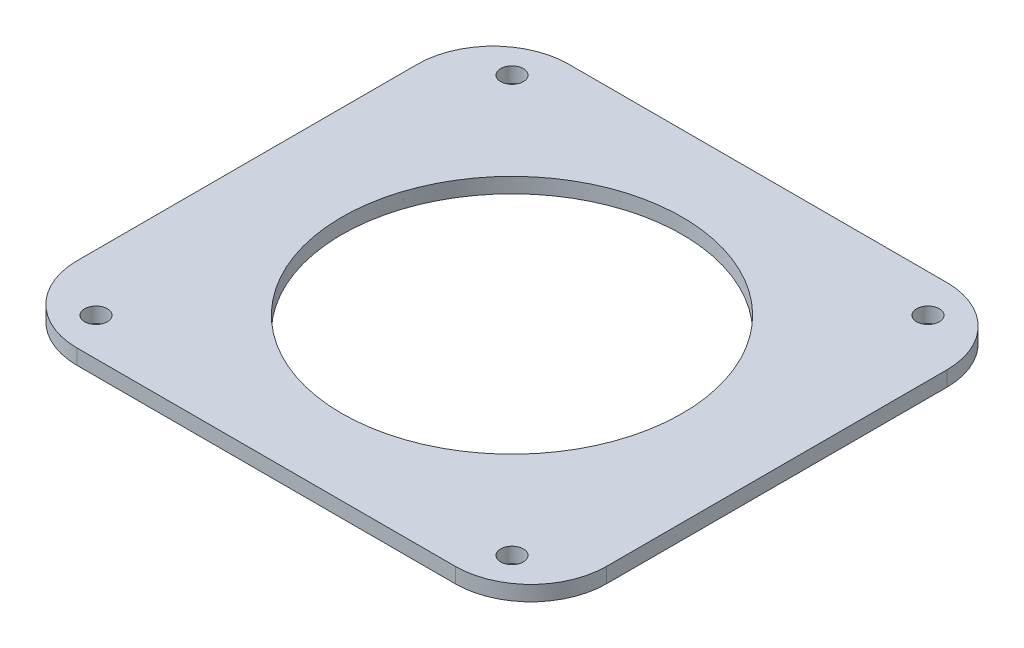
ISO-10303-21;
HEADER;
FILE_DESCRIPTION(('STEP AP214'),'2;1');
FILE_NAME('part.step','',(''),(''),'','','');
FILE_SCHEMA(('AUTOMOTIVE_DESIGN { 1 0 10303 214 1 1 1 1 }'));
ENDSEC;
DATA;
#1=APPLICATION_CONTEXT('core data for automotive mechanical design processes');
#2=APPLICATION_PROTOCOL_DEFINITION('international standard','automotive_design',2000,#1);
#3=PRODUCT_CONTEXT('',#1,'mechanical');
#4=PRODUCT('Part','Part','',(#3));
#5=PRODUCT_RELATED_PRODUCT_CATEGORY('part','',(#4));
#6=PRODUCT_DEFINITION_FORMATION('','',#4);
#7=PRODUCT_DEFINITION_CONTEXT('part definition',#1,'design');
#8=PRODUCT_DEFINITION('design','',#6,#7);
#9=PRODUCT_DEFINITION_SHAPE('','',#8);
#10=(LENGTH_UNIT() NAMED_UNIT(*) SI_UNIT(.MILLI.,.METRE.));
#11=(NAMED_UNIT(*) PLANE_ANGLE_UNIT() SI_UNIT($,.RADIAN.));
#12=(NAMED_UNIT(*) SI_UNIT($,.STERADIAN.) SOLID_ANGLE_UNIT());
#13=UNCERTAINTY_MEASURE_WITH_UNIT(LENGTH_MEASURE(1.E-05),#10,'distance_accuracy_value','');
#14=(GEOMETRIC_REPRESENTATION_CONTEXT(3) GLOBAL_UNCERTAINTY_ASSIGNED_CONTEXT((#13)) GLOBAL_UNIT_ASSIGNED_CONTEXT((#10,
#11,#12)) REPRESENTATION_CONTEXT('',''));
#15=CARTESIAN_POINT('',(0.,0.,0.));
#16=DIRECTION('',(0.,0.,1.));
#17=DIRECTION('',(1.,0.,0.));
#18=AXIS2_PLACEMENT_3D('',#15,#16,#17);
#19=CARTESIAN_POINT('',(25.,10.,22.5));
#20=DIRECTION('',(0.,-1.,0.));
#21=DIRECTION('',(0.,0.,-1.));
#22=AXIS2_PLACEMENT_3D('',#19,#20,#21);
#23=CYLINDRICAL_SURFACE('',#22,10.);
#24=DIRECTION('',(0.,-1.,0.));
#25=VECTOR('',#24,1.);
#26=CARTESIAN_POINT('',(35.,10.,22.5));
#27=LINE('',#26,#25);
#28=CARTESIAN_POINT('',(35.,2.,22.5));
#29=VERTEX_POINT('',#28);
#30=CARTESIAN_POINT('',(35.,0.,22.5));
#31=VERTEX_POINT('',#30);
#32=EDGE_CURVE('E148',#29,#31,#27,.T.);
#33=ORIENTED_EDGE('',*,*,#32,.F.);
#34=CARTESIAN_POINT('',(25.,2.,22.5));
#35=DIRECTION('',(0.,1.,0.));
#36=DIRECTION('',(0.,0.,1.));
#37=AXIS2_PLACEMENT_3D('',#34,#35,#36);
#38=CIRCLE('',#37,10.);
#39=CARTESIAN_POINT('',(25.,2.,32.5));
#40=VERTEX_POINT('',#39);
#41=EDGE_CURVE('E161',#29,#40,#38,.F.);
#42=ORIENTED_EDGE('',*,*,#41,.T.);
#43=DIRECTION('',(0.,-1.,0.));
#44=VECTOR('',#43,1.);
#45=CARTESIAN_POINT('',(25.,10.,32.5));
#46=LINE('',#45,#44);
#47=CARTESIAN_POINT('',(25.,0.,32.5));
#48=VERTEX_POINT('',#47);
#49=EDGE_CURVE('E55',#48,#40,#46,.F.);
#50=ORIENTED_EDGE('',*,*,#49,.F.);
#51=CARTESIAN_POINT('',(25.,0.,22.5));
#52=DIRECTION('',(0.,1.,0.));
#53=DIRECTION('',(0.,0.,1.));
#54=AXIS2_PLACEMENT_3D('',#51,#52,#53);
#55=CIRCLE('',#54,10.);
#56=EDGE_CURVE('E11',#31,#48,#55,.F.);
#57=ORIENTED_EDGE('',*,*,#56,.F.);
#58=EDGE_LOOP('',(#33,#42,#50,#57));
#59=FACE_BOUND('',#58,.T.);
#60=ADVANCED_FACE('F46',(#59),#23,.T.);
#61=CARTESIAN_POINT('',(-25.,10.,22.5));
#62=DIRECTION('',(0.,-1.,0.));
#63=DIRECTION('',(0.,0.,-1.));
#64=AXIS2_PLACEMENT_3D('',#61,#62,#63);
#65=CYLINDRICAL_SURFACE('',#64,10.);
#66=DIRECTION('',(0.,1.,0.));
#67=VECTOR('',#66,1.);
#68=CARTESIAN_POINT('',(-25.,10.,32.5));
#69=LINE('',#68,#67);
#70=CARTESIAN_POINT('',(-25.,2.,32.5));
#71=VERTEX_POINT('',#70);
#72=CARTESIAN_POINT('',(-25.,0.,32.5));
#73=VERTEX_POINT('',#72);
#74=EDGE_CURVE('E127',#71,#73,#69,.F.);
#75=ORIENTED_EDGE('',*,*,#74,.F.);
#76=CARTESIAN_POINT('',(-25.,2.,22.5));
#77=DIRECTION('',(0.,1.,0.));
#78=DIRECTION('',(0.,0.,1.));
#79=AXIS2_PLACEMENT_3D('',#76,#77,#78);
#80=CIRCLE('',#79,10.);
#81=CARTESIAN_POINT('',(-35.,2.,22.5));
#82=VERTEX_POINT('',#81);
#83=EDGE_CURVE('E112',#71,#82,#80,.F.);
#84=ORIENTED_EDGE('',*,*,#83,.T.);
#85=DIRECTION('',(0.,1.,0.));
#86=VECTOR('',#85,1.);
#87=CARTESIAN_POINT('',(-35.,10.,22.5));
#88=LINE('',#87,#86);
#89=CARTESIAN_POINT('',(-35.,0.,22.5));
#90=VERTEX_POINT('',#89);
#91=EDGE_CURVE('E125',#90,#82,#88,.T.);
#92=ORIENTED_EDGE('',*,*,#91,.F.);
#93=CARTESIAN_POINT('',(-25.,0.,22.5));
#94=DIRECTION('',(0.,1.,0.));
#95=DIRECTION('',(0.,0.,1.));
#96=AXIS2_PLACEMENT_3D('',#93,#94,#95);
#97=CIRCLE('',#96,10.);
#98=EDGE_CURVE('E139',#73,#90,#97,.F.);
#99=ORIENTED_EDGE('',*,*,#98,.F.);
#100=EDGE_LOOP('',(#75,#84,#92,#99));
#101=FACE_BOUND('',#100,.T.);
#102=ADVANCED_FACE('F123',(#101),#65,.T.);
#103=CARTESIAN_POINT('',(25.,10.,-22.5));
#104=DIRECTION('',(0.,1.,0.));
#105=DIRECTION('',(0.,0.,1.));
#106=AXIS2_PLACEMENT_3D('',#103,#104,#105);
#107=CYLINDRICAL_SURFACE('',#106,10.);
#108=DIRECTION('',(0.,-1.,0.));
#109=VECTOR('',#108,1.);
#110=CARTESIAN_POINT('',(25.,10.,-32.5));
#111=LINE('',#110,#109);
#112=CARTESIAN_POINT('',(25.,2.,-32.5));
#113=VERTEX_POINT('',#112);
#114=CARTESIAN_POINT('',(25.,0.,-32.5));
#115=VERTEX_POINT('',#114);
#116=EDGE_CURVE('E215',#113,#115,#111,.T.);
#117=ORIENTED_EDGE('',*,*,#116,.F.);
#118=CARTESIAN_POINT('',(25.,2.,-22.5));
#119=DIRECTION('',(0.,1.,0.));
#120=DIRECTION('',(0.,0.,1.));
#121=AXIS2_PLACEMENT_3D('',#118,#119,#120);
#122=CIRCLE('',#121,10.);
#123=CARTESIAN_POINT('',(35.,2.,-22.5));
#124=VERTEX_POINT('',#123);
#125=EDGE_CURVE('E165',#113,#124,#122,.F.);
#126=ORIENTED_EDGE('',*,*,#125,.T.);
#127=DIRECTION('',(0.,-1.,0.));
#128=VECTOR('',#127,1.);
#129=CARTESIAN_POINT('',(35.,10.,-22.5));
#130=LINE('',#129,#128);
#131=CARTESIAN_POINT('',(35.,0.,-22.5));
#132=VERTEX_POINT('',#131);
#133=EDGE_CURVE('E142',#132,#124,#130,.F.);
#134=ORIENTED_EDGE('',*,*,#133,.F.);
#135=CARTESIAN_POINT('',(25.,0.,-22.5));
#136=DIRECTION('',(0.,1.,0.));
#137=DIRECTION('',(0.,0.,1.));
#138=AXIS2_PLACEMENT_3D('',#135,#136,#137);
#139=CIRCLE('',#138,10.);
#140=EDGE_CURVE('E135',#115,#132,#139,.F.);
#141=ORIENTED_EDGE('',*,*,#140,.F.);
#142=EDGE_LOOP('',(#117,#126,#134,#141));
#143=FACE_BOUND('',#142,.T.);
#144=ADVANCED_FACE('F225',(#143),#107,.T.);
#145=CARTESIAN_POINT('',(-25.,10.,-22.5));
#146=DIRECTION('',(0.,1.,0.));
#147=DIRECTION('',(0.,0.,1.));
#148=AXIS2_PLACEMENT_3D('',#145,#146,#147);
#149=CYLINDRICAL_SURFACE('',#148,10.);
#150=DIRECTION('',(0.,1.,0.));
#151=VECTOR('',#150,1.);
#152=CARTESIAN_POINT('',(-35.,10.,-22.5));
#153=LINE('',#152,#151);
#154=CARTESIAN_POINT('',(-35.,2.,-22.5));
#155=VERTEX_POINT('',#154);
#156=CARTESIAN_POINT('',(-35.,0.,-22.5));
#157=VERTEX_POINT('',#156);
#158=EDGE_CURVE('E209',#155,#157,#153,.F.);
#159=ORIENTED_EDGE('',*,*,#158,.F.);
#160=CARTESIAN_POINT('',(-25.,2.,-22.5));
#161=DIRECTION('',(0.,1.,0.));
#162=DIRECTION('',(0.,0.,1.));
#163=AXIS2_PLACEMENT_3D('',#160,#161,#162);
#164=CIRCLE('',#163,10.);
#165=CARTESIAN_POINT('',(-25.,2.,-32.5));
#166=VERTEX_POINT('',#165);
#167=EDGE_CURVE('E62',#155,#166,#164,.F.);
#168=ORIENTED_EDGE('',*,*,#167,.T.);
#169=DIRECTION('',(0.,1.,0.));
#170=VECTOR('',#169,1.);
#171=CARTESIAN_POINT('',(-25.,10.,-32.5));
#172=LINE('',#171,#170);
#173=CARTESIAN_POINT('',(-25.,0.,-32.5));
#174=VERTEX_POINT('',#173);
#175=EDGE_CURVE('E205',#174,#166,#172,.T.);
#176=ORIENTED_EDGE('',*,*,#175,.F.);
#177=CARTESIAN_POINT('',(-25.,0.,-22.5));
#178=DIRECTION('',(0.,1.,0.));
#179=DIRECTION('',(0.,0.,1.));
#180=AXIS2_PLACEMENT_3D('',#177,#178,#179);
#181=CIRCLE('',#180,10.);
#182=EDGE_CURVE('E212',#157,#174,#181,.F.);
#183=ORIENTED_EDGE('',*,*,#182,.F.);
#184=EDGE_LOOP('',(#159,#168,#176,#183));
#185=FACE_BOUND('',#184,.T.);
#186=ADVANCED_FACE('F293',(#185),#149,.T.);
#187=CARTESIAN_POINT('',(0.,10.,32.5));
#188=DIRECTION('',(0.,0.,-1.));
#189=DIRECTION('',(-1.,0.,0.));
#190=AXIS2_PLACEMENT_3D('',#187,#188,#189);
#191=PLANE('',#190);
#192=DIRECTION('',(1.,0.,0.));
#193=VECTOR('',#192,1.);
#194=CARTESIAN_POINT('',(0.,2.,32.5));
#195=LINE('',#194,#193);
#196=EDGE_CURVE('E156',#71,#40,#195,.T.);
#197=ORIENTED_EDGE('',*,*,#196,.F.);
#198=ORIENTED_EDGE('',*,*,#74,.T.);
#199=DIRECTION('',(1.,0.,0.));
#200=VECTOR('',#199,1.);
#201=CARTESIAN_POINT('',(0.,0.,32.5));
#202=LINE('',#201,#200);
#203=EDGE_CURVE('E157',#73,#48,#202,.T.);
#204=ORIENTED_EDGE('',*,*,#203,.T.);
#205=ORIENTED_EDGE('',*,*,#49,.T.);
#206=EDGE_LOOP('',(#197,#198,#204,#205));
#207=FACE_BOUND('',#206,.T.);
#208=ADVANCED_FACE('F155',(#207),#191,.F.);
#209=CARTESIAN_POINT('',(35.,10.,0.));
#210=DIRECTION('',(-1.,0.,0.));
#211=DIRECTION('',(0.,0.,1.));
#212=AXIS2_PLACEMENT_3D('',#209,#210,#211);
#213=PLANE('',#212);
#214=DIRECTION('',(0.,0.,-1.));
#215=VECTOR('',#214,1.);
#216=CARTESIAN_POINT('',(35.,2.,0.));
#217=LINE('',#216,#215);
#218=EDGE_CURVE('E164',#29,#124,#217,.T.);
#219=ORIENTED_EDGE('',*,*,#218,.F.);
#220=ORIENTED_EDGE('',*,*,#32,.T.);
#221=DIRECTION('',(0.,0.,-1.));
#222=VECTOR('',#221,1.);
#223=CARTESIAN_POINT('',(35.,0.,0.));
#224=LINE('',#223,#222);
#225=EDGE_CURVE('E192',#31,#132,#224,.T.);
#226=ORIENTED_EDGE('',*,*,#225,.T.);
#227=ORIENTED_EDGE('',*,*,#133,.T.);
#228=EDGE_LOOP('',(#219,#220,#226,#227));
#229=FACE_BOUND('',#228,.T.);
#230=ADVANCED_FACE('F221',(#229),#213,.F.);
#231=CARTESIAN_POINT('',(0.,10.,-32.5));
#232=DIRECTION('',(0.,0.,-1.));
#233=DIRECTION('',(-1.,0.,0.));
#234=AXIS2_PLACEMENT_3D('',#231,#232,#233);
#235=PLANE('',#234);
#236=ORIENTED_EDGE('',*,*,#175,.T.);
#237=DIRECTION('',(1.,0.,0.));
#238=VECTOR('',#237,1.);
#239=CARTESIAN_POINT('',(0.,2.,-32.5));
#240=LINE('',#239,#238);
#241=EDGE_CURVE('E129',#166,#113,#240,.T.);
#242=ORIENTED_EDGE('',*,*,#241,.T.);
#243=ORIENTED_EDGE('',*,*,#116,.T.);
#244=DIRECTION('',(1.,0.,0.));
#245=VECTOR('',#244,1.);
#246=CARTESIAN_POINT('',(0.,0.,-32.5));
#247=LINE('',#246,#245);
#248=EDGE_CURVE('E195',#174,#115,#247,.T.);
#249=ORIENTED_EDGE('',*,*,#248,.F.);
#250=EDGE_LOOP('',(#236,#242,#243,#249));
#251=FACE_BOUND('',#250,.T.);
#252=ADVANCED_FACE('F228',(#251),#235,.T.);
#253=CARTESIAN_POINT('',(-35.,10.,0.));
#254=DIRECTION('',(-1.,0.,0.));
#255=DIRECTION('',(0.,0.,1.));
#256=AXIS2_PLACEMENT_3D('',#253,#254,#255);
#257=PLANE('',#256);
#258=ORIENTED_EDGE('',*,*,#91,.T.);
#259=DIRECTION('',(0.,0.,-1.));
#260=VECTOR('',#259,1.);
#261=CARTESIAN_POINT('',(-35.,2.,0.));
#262=LINE('',#261,#260);
#263=EDGE_CURVE('E109',#82,#155,#262,.T.);
#264=ORIENTED_EDGE('',*,*,#263,.T.);
#265=ORIENTED_EDGE('',*,*,#158,.T.);
#266=DIRECTION('',(0.,0.,-1.));
#267=VECTOR('',#266,1.);
#268=CARTESIAN_POINT('',(-35.,0.,0.));
#269=LINE('',#268,#267);
#270=EDGE_CURVE('E133',#90,#157,#269,.T.);
#271=ORIENTED_EDGE('',*,*,#270,.F.);
#272=EDGE_LOOP('',(#258,#264,#265,#271));
#273=FACE_BOUND('',#272,.T.);
#274=ADVANCED_FACE('F131',(#273),#257,.T.);
#275=CARTESIAN_POINT('',(-27.5,10.,27.5));
#276=DIRECTION('',(0.,-1.,0.));
#277=DIRECTION('',(0.,0.,-1.));
#278=AXIS2_PLACEMENT_3D('',#275,#276,#277);
#279=CYLINDRICAL_SURFACE('',#278,1.5);
#280=CARTESIAN_POINT('',(-27.5,0.,27.5));
#281=DIRECTION('',(0.,1.,0.));
#282=DIRECTION('',(0.,0.,1.));
#283=AXIS2_PLACEMENT_3D('',#280,#281,#282);
#284=CIRCLE('',#283,1.5);
#285=CARTESIAN_POINT('',(-27.5,0.,29.));
#286=VERTEX_POINT('',#285);
#287=EDGE_CURVE('E186',#286,#286,#284,.T.);
#288=ORIENTED_EDGE('',*,*,#287,.F.);
#289=EDGE_LOOP('',(#288));
#290=FACE_BOUND('',#289,.T.);
#291=CARTESIAN_POINT('',(-27.5,2.,27.5));
#292=DIRECTION('',(0.,1.,0.));
#293=DIRECTION('',(0.,0.,1.));
#294=AXIS2_PLACEMENT_3D('',#291,#292,#293);
#295=CIRCLE('',#294,1.5);
#296=CARTESIAN_POINT('',(-27.5,2.,29.));
#297=VERTEX_POINT('',#296);
#298=EDGE_CURVE('E118',#297,#297,#295,.T.);
#299=ORIENTED_EDGE('',*,*,#298,.T.);
#300=EDGE_LOOP('',(#299));
#301=FACE_BOUND('',#300,.T.);
#302=ADVANCED_FACE('F270',(#290,#301),#279,.F.);
#303=CARTESIAN_POINT('',(-27.5,10.,-27.5));
#304=DIRECTION('',(0.,-1.,0.));
#305=DIRECTION('',(0.,0.,-1.));
#306=AXIS2_PLACEMENT_3D('',#303,#304,#305);
#307=CYLINDRICAL_SURFACE('',#306,1.5);
#308=CARTESIAN_POINT('',(-27.5,0.,-27.5));
#309=DIRECTION('',(0.,1.,0.));
#310=DIRECTION('',(0.,0.,1.));
#311=AXIS2_PLACEMENT_3D('',#308,#309,#310);
#312=CIRCLE('',#311,1.5);
#313=CARTESIAN_POINT('',(-27.5,0.,-26.));
#314=VERTEX_POINT('',#313);
#315=EDGE_CURVE('E182',#314,#314,#312,.T.);
#316=ORIENTED_EDGE('',*,*,#315,.F.);
#317=EDGE_LOOP('',(#316));
#318=FACE_BOUND('',#317,.T.);
#319=CARTESIAN_POINT('',(-27.5,2.,-27.5));
#320=DIRECTION('',(0.,1.,0.));
#321=DIRECTION('',(0.,0.,1.));
#322=AXIS2_PLACEMENT_3D('',#319,#320,#321);
#323=CIRCLE('',#322,1.5);
#324=CARTESIAN_POINT('',(-27.5,2.,-26.));
#325=VERTEX_POINT('',#324);
#326=EDGE_CURVE('E240',#325,#325,#323,.T.);
#327=ORIENTED_EDGE('',*,*,#326,.T.);
#328=EDGE_LOOP('',(#327));
#329=FACE_BOUND('',#328,.T.);
#330=ADVANCED_FACE('F272',(#318,#329),#307,.F.);
#331=CARTESIAN_POINT('',(27.5,10.,27.5));
#332=DIRECTION('',(0.,-1.,0.));
#333=DIRECTION('',(0.,0.,-1.));
#334=AXIS2_PLACEMENT_3D('',#331,#332,#333);
#335=CYLINDRICAL_SURFACE('',#334,1.5);
#336=CARTESIAN_POINT('',(27.5,0.,27.5));
#337=DIRECTION('',(0.,1.,0.));
#338=DIRECTION('',(0.,0.,1.));
#339=AXIS2_PLACEMENT_3D('',#336,#337,#338);
#340=CIRCLE('',#339,1.5);
#341=CARTESIAN_POINT('',(27.5,0.,29.));
#342=VERTEX_POINT('',#341);
#343=EDGE_CURVE('E178',#342,#342,#340,.T.);
#344=ORIENTED_EDGE('',*,*,#343,.F.);
#345=EDGE_LOOP('',(#344));
#346=FACE_BOUND('',#345,.T.);
#347=CARTESIAN_POINT('',(27.5,2.,27.5));
#348=DIRECTION('',(0.,1.,0.));
#349=DIRECTION('',(0.,0.,1.));
#350=AXIS2_PLACEMENT_3D('',#347,#348,#349);
#351=CIRCLE('',#350,1.5);
#352=CARTESIAN_POINT('',(27.5,2.,29.));
#353=VERTEX_POINT('',#352);
#354=EDGE_CURVE('E244',#353,#353,#351,.T.);
#355=ORIENTED_EDGE('',*,*,#354,.T.);
#356=EDGE_LOOP('',(#355));
#357=FACE_BOUND('',#356,.T.);
#358=ADVANCED_FACE('F279',(#346,#357),#335,.F.);
#359=CARTESIAN_POINT('',(27.5,10.,-27.5));
#360=DIRECTION('',(0.,-1.,0.));
#361=DIRECTION('',(0.,0.,-1.));
#362=AXIS2_PLACEMENT_3D('',#359,#360,#361);
#363=CYLINDRICAL_SURFACE('',#362,1.5);
#364=CARTESIAN_POINT('',(27.5,0.,-27.5));
#365=DIRECTION('',(0.,1.,0.));
#366=DIRECTION('',(0.,0.,1.));
#367=AXIS2_PLACEMENT_3D('',#364,#365,#366);
#368=CIRCLE('',#367,1.5);
#369=CARTESIAN_POINT('',(27.5,0.,-26.));
#370=VERTEX_POINT('',#369);
#371=EDGE_CURVE('E169',#370,#370,#368,.T.);
#372=ORIENTED_EDGE('',*,*,#371,.F.);
#373=EDGE_LOOP('',(#372));
#374=FACE_BOUND('',#373,.T.);
#375=CARTESIAN_POINT('',(27.5,2.,-27.5));
#376=DIRECTION('',(0.,1.,0.));
#377=DIRECTION('',(0.,0.,1.));
#378=AXIS2_PLACEMENT_3D('',#375,#376,#377);
#379=CIRCLE('',#378,1.5);
#380=CARTESIAN_POINT('',(27.5,2.,-26.));
#381=VERTEX_POINT('',#380);
#382=EDGE_CURVE('E248',#381,#381,#379,.T.);
#383=ORIENTED_EDGE('',*,*,#382,.T.);
#384=EDGE_LOOP('',(#383));
#385=FACE_BOUND('',#384,.T.);
#386=ADVANCED_FACE('F299',(#374,#385),#363,.F.);
#387=CARTESIAN_POINT('',(0.,10.,0.));
#388=DIRECTION('',(0.,-1.,0.));
#389=DIRECTION('',(0.,0.,-1.));
#390=AXIS2_PLACEMENT_3D('',#387,#388,#389);
#391=CYLINDRICAL_SURFACE('',#390,22.5);
#392=CARTESIAN_POINT('',(0.,0.,0.));
#393=DIRECTION('',(0.,1.,0.));
#394=DIRECTION('',(0.,0.,1.));
#395=AXIS2_PLACEMENT_3D('',#392,#393,#394);
#396=CIRCLE('',#395,22.5);
#397=CARTESIAN_POINT('',(0.,0.,22.5));
#398=VERTEX_POINT('',#397);
#399=EDGE_CURVE('E201',#398,#398,#396,.T.);
#400=ORIENTED_EDGE('',*,*,#399,.F.);
#401=EDGE_LOOP('',(#400));
#402=FACE_BOUND('',#401,.T.);
#403=CARTESIAN_POINT('',(0.,2.,0.));
#404=DIRECTION('',(0.,1.,0.));
#405=DIRECTION('',(0.,0.,1.));
#406=AXIS2_PLACEMENT_3D('',#403,#404,#405);
#407=CIRCLE('',#406,22.5);
#408=CARTESIAN_POINT('',(0.,2.,22.5));
#409=VERTEX_POINT('',#408);
#410=EDGE_CURVE('E49',#409,#409,#407,.T.);
#411=ORIENTED_EDGE('',*,*,#410,.T.);
#412=EDGE_LOOP('',(#411));
#413=FACE_BOUND('',#412,.T.);
#414=ADVANCED_FACE('F257',(#402,#413),#391,.F.);
#415=CARTESIAN_POINT('',(0.,0.,0.));
#416=DIRECTION('',(0.,1.,0.));
#417=DIRECTION('',(0.,0.,1.));
#418=AXIS2_PLACEMENT_3D('',#415,#416,#417);
#419=PLANE('',#418);
#420=ORIENTED_EDGE('',*,*,#371,.T.);
#421=EDGE_LOOP('',(#420));
#422=FACE_BOUND('',#421,.T.);
#423=ORIENTED_EDGE('',*,*,#343,.T.);
#424=EDGE_LOOP('',(#423));
#425=FACE_BOUND('',#424,.T.);
#426=ORIENTED_EDGE('',*,*,#315,.T.);
#427=EDGE_LOOP('',(#426));
#428=FACE_BOUND('',#427,.T.);
#429=ORIENTED_EDGE('',*,*,#287,.T.);
#430=EDGE_LOOP('',(#429));
#431=FACE_BOUND('',#430,.T.);
#432=ORIENTED_EDGE('',*,*,#225,.F.);
#433=ORIENTED_EDGE('',*,*,#56,.T.);
#434=ORIENTED_EDGE('',*,*,#203,.F.);
#435=ORIENTED_EDGE('',*,*,#98,.T.);
#436=ORIENTED_EDGE('',*,*,#270,.T.);
#437=ORIENTED_EDGE('',*,*,#182,.T.);
#438=ORIENTED_EDGE('',*,*,#248,.T.);
#439=ORIENTED_EDGE('',*,*,#140,.T.);
#440=EDGE_LOOP('',(#432,#433,#434,#435,#436,#437,#438,#439));
#441=FACE_BOUND('',#440,.T.);
#442=ORIENTED_EDGE('',*,*,#399,.T.);
#443=EDGE_LOOP('',(#442));
#444=FACE_BOUND('',#443,.T.);
#445=ADVANCED_FACE('F261',(#422,#425,#428,#431,#441,#444),#419,.F.);
#446=CARTESIAN_POINT('',(0.,2.,0.));
#447=DIRECTION('',(0.,1.,0.));
#448=DIRECTION('',(0.,0.,1.));
#449=AXIS2_PLACEMENT_3D('',#446,#447,#448);
#450=PLANE('',#449);
#451=ORIENTED_EDGE('',*,*,#410,.F.);
#452=EDGE_LOOP('',(#451));
#453=FACE_BOUND('',#452,.T.);
#454=ORIENTED_EDGE('',*,*,#382,.F.);
#455=EDGE_LOOP('',(#454));
#456=FACE_BOUND('',#455,.T.);
#457=ORIENTED_EDGE('',*,*,#354,.F.);
#458=EDGE_LOOP('',(#457));
#459=FACE_BOUND('',#458,.T.);
#460=ORIENTED_EDGE('',*,*,#326,.F.);
#461=EDGE_LOOP('',(#460));
#462=FACE_BOUND('',#461,.T.);
#463=ORIENTED_EDGE('',*,*,#298,.F.);
#464=EDGE_LOOP('',(#463));
#465=FACE_BOUND('',#464,.T.);
#466=ORIENTED_EDGE('',*,*,#218,.T.);
#467=ORIENTED_EDGE('',*,*,#125,.F.);
#468=ORIENTED_EDGE('',*,*,#241,.F.);
#469=ORIENTED_EDGE('',*,*,#167,.F.);
#470=ORIENTED_EDGE('',*,*,#263,.F.);
#471=ORIENTED_EDGE('',*,*,#83,.F.);
#472=ORIENTED_EDGE('',*,*,#196,.T.);
#473=ORIENTED_EDGE('',*,*,#41,.F.);
#474=EDGE_LOOP('',(#466,#467,#468,#469,#470,#471,#472,#473));
#475=FACE_BOUND('',#474,.T.);
#476=ADVANCED_FACE('F111',(#453,#456,#459,#462,#465,#475),#450,.T.);
#477=CLOSED_SHELL('',(#60,#102,#144,#186,#208,#230,#252,#274,#302,#330,#358,#386,#414,#445,#476));
#478=MANIFOLD_SOLID_BREP('B2',#477);
#479=ADVANCED_BREP_SHAPE_REPRESENTATION('',(#18,#478),#14);
#480=SHAPE_DEFINITION_REPRESENTATION(#9,#479);
ENDSEC;
END-ISO-10303-21;
